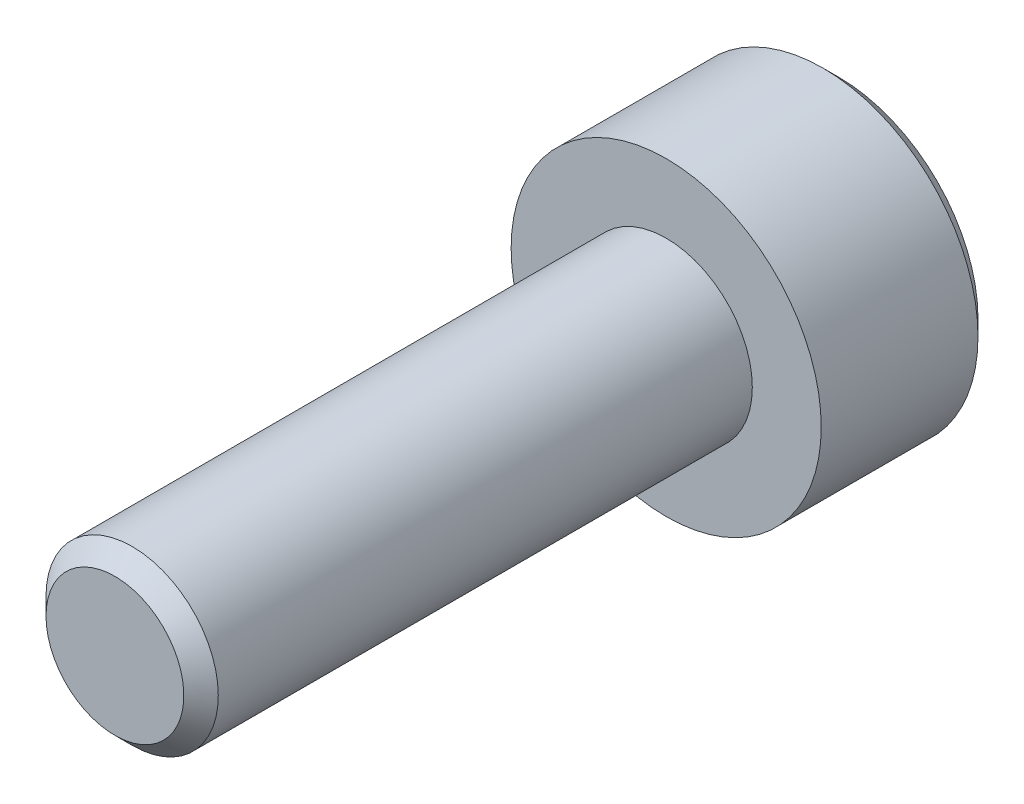
ISO-10303-21;
HEADER;
FILE_DESCRIPTION(('STEP AP214'),'2;1');
FILE_NAME('part.step','',(''),(''),'','','');
FILE_SCHEMA(('AUTOMOTIVE_DESIGN { 1 0 10303 214 1 1 1 1 }'));
ENDSEC;
DATA;
#1=APPLICATION_CONTEXT('core data for automotive mechanical design processes');
#2=APPLICATION_PROTOCOL_DEFINITION('international standard','automotive_design',2000,#1);
#3=PRODUCT_CONTEXT('',#1,'mechanical');
#4=PRODUCT('Part','Part','',(#3));
#5=PRODUCT_RELATED_PRODUCT_CATEGORY('part','',(#4));
#6=PRODUCT_DEFINITION_FORMATION('','',#4);
#7=PRODUCT_DEFINITION_CONTEXT('part definition',#1,'design');
#8=PRODUCT_DEFINITION('design','',#6,#7);
#9=PRODUCT_DEFINITION_SHAPE('','',#8);
#10=(LENGTH_UNIT() NAMED_UNIT(*) SI_UNIT(.MILLI.,.METRE.));
#11=(NAMED_UNIT(*) PLANE_ANGLE_UNIT() SI_UNIT($,.RADIAN.));
#12=(NAMED_UNIT(*) SI_UNIT($,.STERADIAN.) SOLID_ANGLE_UNIT());
#13=UNCERTAINTY_MEASURE_WITH_UNIT(LENGTH_MEASURE(1.E-05),#10,'distance_accuracy_value','');
#14=(GEOMETRIC_REPRESENTATION_CONTEXT(3) GLOBAL_UNCERTAINTY_ASSIGNED_CONTEXT((#13)) GLOBAL_UNIT_ASSIGNED_CONTEXT((#10,
#11,#12)) REPRESENTATION_CONTEXT('',''));
#15=CARTESIAN_POINT('',(0.,0.,0.));
#16=DIRECTION('',(0.,0.,1.));
#17=DIRECTION('',(1.,0.,0.));
#18=AXIS2_PLACEMENT_3D('',#15,#16,#17);
#19=CARTESIAN_POINT('',(0.,0.,-1.5));
#20=DIRECTION('',(0.,0.,1.));
#21=DIRECTION('',(1.,0.,0.));
#22=AXIS2_PLACEMENT_3D('',#19,#20,#21);
#23=PLANE('',#22);
#24=DIRECTION('',(-0.866025403784439,-0.5,0.));
#25=VECTOR('',#24,1.);
#26=CARTESIAN_POINT('',(-1.,0.577350269189626,-1.5));
#27=LINE('',#26,#25);
#28=CARTESIAN_POINT('',(-1.,0.577350269189626,-1.5));
#29=VERTEX_POINT('',#28);
#30=CARTESIAN_POINT('',(0.,1.15470053837925,-1.5));
#31=VERTEX_POINT('',#30);
#32=EDGE_CURVE('E125',#29,#31,#27,.F.);
#33=ORIENTED_EDGE('',*,*,#32,.T.);
#34=DIRECTION('',(-0.866025403784439,0.5,0.));
#35=VECTOR('',#34,1.);
#36=CARTESIAN_POINT('',(0.,1.15470053837925,-1.5));
#37=LINE('',#36,#35);
#38=CARTESIAN_POINT('',(1.,0.577350269189626,-1.5));
#39=VERTEX_POINT('',#38);
#40=EDGE_CURVE('E74',#31,#39,#37,.F.);
#41=ORIENTED_EDGE('',*,*,#40,.T.);
#42=DIRECTION('',(0.,1.,0.));
#43=VECTOR('',#42,1.);
#44=CARTESIAN_POINT('',(1.,0.577350269189626,-1.5));
#45=LINE('',#44,#43);
#46=CARTESIAN_POINT('',(1.,-0.577350269189626,-1.5));
#47=VERTEX_POINT('',#46);
#48=EDGE_CURVE('E71',#39,#47,#45,.F.);
#49=ORIENTED_EDGE('',*,*,#48,.T.);
#50=DIRECTION('',(0.866025403784439,0.499999999999999,0.));
#51=VECTOR('',#50,1.);
#52=CARTESIAN_POINT('',(1.,-0.577350269189626,-1.5));
#53=LINE('',#52,#51);
#54=CARTESIAN_POINT('',(0.,-1.15470053837925,-1.5));
#55=VERTEX_POINT('',#54);
#56=EDGE_CURVE('E68',#47,#55,#53,.F.);
#57=ORIENTED_EDGE('',*,*,#56,.T.);
#58=DIRECTION('',(0.866025403784438,-0.5,0.));
#59=VECTOR('',#58,1.);
#60=CARTESIAN_POINT('',(0.,-1.15470053837925,-1.5));
#61=LINE('',#60,#59);
#62=CARTESIAN_POINT('',(-1.,-0.577350269189625,-1.5));
#63=VERTEX_POINT('',#62);
#64=EDGE_CURVE('E91',#55,#63,#61,.F.);
#65=ORIENTED_EDGE('',*,*,#64,.T.);
#66=DIRECTION('',(0.,1.,0.));
#67=VECTOR('',#66,1.);
#68=CARTESIAN_POINT('',(-1.,-0.577350269189625,-1.5));
#69=LINE('',#68,#67);
#70=EDGE_CURVE('E130',#63,#29,#69,.T.);
#71=ORIENTED_EDGE('',*,*,#70,.T.);
#72=EDGE_LOOP('',(#33,#41,#49,#57,#65,#71));
#73=FACE_BOUND('',#72,.T.);
#74=ADVANCED_FACE('F17',(#73),#23,.F.);
#75=CARTESIAN_POINT('',(1.,0.577350269189626,-2.5));
#76=DIRECTION('',(1.,0.,0.));
#77=DIRECTION('',(0.,0.,-1.));
#78=AXIS2_PLACEMENT_3D('',#75,#76,#77);
#79=PLANE('',#78);
#80=ORIENTED_EDGE('',*,*,#48,.F.);
#81=DIRECTION('',(0.,0.,1.));
#82=VECTOR('',#81,1.);
#83=CARTESIAN_POINT('',(1.,0.577350269189625,-2.5));
#84=LINE('',#83,#82);
#85=CARTESIAN_POINT('',(1.,0.577350269189626,-2.5));
#86=VERTEX_POINT('',#85);
#87=EDGE_CURVE('E120',#39,#86,#84,.F.);
#88=ORIENTED_EDGE('',*,*,#87,.T.);
#89=DIRECTION('',(0.,1.,0.));
#90=VECTOR('',#89,1.);
#91=CARTESIAN_POINT('',(1.,0.,-2.5));
#92=LINE('',#91,#90);
#93=CARTESIAN_POINT('',(1.,-0.577350269189626,-2.5));
#94=VERTEX_POINT('',#93);
#95=EDGE_CURVE('E82',#86,#94,#92,.F.);
#96=ORIENTED_EDGE('',*,*,#95,.T.);
#97=DIRECTION('',(0.,0.,1.));
#98=VECTOR('',#97,1.);
#99=CARTESIAN_POINT('',(1.,-0.577350269189626,-2.5));
#100=LINE('',#99,#98);
#101=EDGE_CURVE('E77',#94,#47,#100,.T.);
#102=ORIENTED_EDGE('',*,*,#101,.T.);
#103=EDGE_LOOP('',(#80,#88,#96,#102));
#104=FACE_BOUND('',#103,.T.);
#105=ADVANCED_FACE('F80',(#104),#79,.F.);
#106=CARTESIAN_POINT('',(1.,-0.577350269189626,-2.5));
#107=DIRECTION('',(0.499999999999999,-0.866025403784439,0.));
#108=DIRECTION('',(0.866025403784439,0.499999999999999,0.));
#109=AXIS2_PLACEMENT_3D('',#106,#107,#108);
#110=PLANE('',#109);
#111=ORIENTED_EDGE('',*,*,#56,.F.);
#112=ORIENTED_EDGE('',*,*,#101,.F.);
#113=DIRECTION('',(-0.866025403784439,-0.499999999999999,0.));
#114=VECTOR('',#113,1.);
#115=CARTESIAN_POINT('',(1.,-0.577350269189626,-2.5));
#116=LINE('',#115,#114);
#117=CARTESIAN_POINT('',(0.,-1.15470053837925,-2.5));
#118=VERTEX_POINT('',#117);
#119=EDGE_CURVE('E117',#94,#118,#116,.T.);
#120=ORIENTED_EDGE('',*,*,#119,.T.);
#121=DIRECTION('',(0.,0.,1.));
#122=VECTOR('',#121,1.);
#123=CARTESIAN_POINT('',(0.,-1.15470053837925,-2.5));
#124=LINE('',#123,#122);
#125=EDGE_CURVE('E88',#118,#55,#124,.T.);
#126=ORIENTED_EDGE('',*,*,#125,.T.);
#127=EDGE_LOOP('',(#111,#112,#120,#126));
#128=FACE_BOUND('',#127,.T.);
#129=ADVANCED_FACE('F86',(#128),#110,.F.);
#130=CARTESIAN_POINT('',(0.,-1.15470053837925,-2.5));
#131=DIRECTION('',(-0.5,-0.866025403784438,0.));
#132=DIRECTION('',(0.866025403784438,-0.5,0.));
#133=AXIS2_PLACEMENT_3D('',#130,#131,#132);
#134=PLANE('',#133);
#135=ORIENTED_EDGE('',*,*,#64,.F.);
#136=ORIENTED_EDGE('',*,*,#125,.F.);
#137=DIRECTION('',(-0.866025403784439,0.5,0.));
#138=VECTOR('',#137,1.);
#139=CARTESIAN_POINT('',(0.,-1.15470053837925,-2.5));
#140=LINE('',#139,#138);
#141=CARTESIAN_POINT('',(-1.,-0.577350269189625,-2.5));
#142=VERTEX_POINT('',#141);
#143=EDGE_CURVE('E115',#118,#142,#140,.T.);
#144=ORIENTED_EDGE('',*,*,#143,.T.);
#145=DIRECTION('',(0.,0.,1.));
#146=VECTOR('',#145,1.);
#147=CARTESIAN_POINT('',(-1.,-0.577350269189625,-2.5));
#148=LINE('',#147,#146);
#149=EDGE_CURVE('E132',#142,#63,#148,.T.);
#150=ORIENTED_EDGE('',*,*,#149,.T.);
#151=EDGE_LOOP('',(#135,#136,#144,#150));
#152=FACE_BOUND('',#151,.T.);
#153=ADVANCED_FACE('F137',(#152),#134,.F.);
#154=CARTESIAN_POINT('',(-1.,-0.577350269189625,-2.5));
#155=DIRECTION('',(-1.,0.,0.));
#156=DIRECTION('',(0.,0.,1.));
#157=AXIS2_PLACEMENT_3D('',#154,#155,#156);
#158=PLANE('',#157);
#159=ORIENTED_EDGE('',*,*,#70,.F.);
#160=ORIENTED_EDGE('',*,*,#149,.F.);
#161=DIRECTION('',(0.,1.,0.));
#162=VECTOR('',#161,1.);
#163=CARTESIAN_POINT('',(-1.,0.,-2.5));
#164=LINE('',#163,#162);
#165=CARTESIAN_POINT('',(-1.,0.577350269189626,-2.5));
#166=VERTEX_POINT('',#165);
#167=EDGE_CURVE('E113',#142,#166,#164,.T.);
#168=ORIENTED_EDGE('',*,*,#167,.T.);
#169=DIRECTION('',(0.,0.,1.));
#170=VECTOR('',#169,1.);
#171=CARTESIAN_POINT('',(-1.,0.577350269189626,-2.5));
#172=LINE('',#171,#170);
#173=EDGE_CURVE('E127',#166,#29,#172,.T.);
#174=ORIENTED_EDGE('',*,*,#173,.T.);
#175=EDGE_LOOP('',(#159,#160,#168,#174));
#176=FACE_BOUND('',#175,.T.);
#177=ADVANCED_FACE('F141',(#176),#158,.F.);
#178=CARTESIAN_POINT('',(-1.,0.577350269189626,-2.5));
#179=DIRECTION('',(-0.5,0.866025403784439,0.));
#180=DIRECTION('',(-0.866025403784439,-0.5,0.));
#181=AXIS2_PLACEMENT_3D('',#178,#179,#180);
#182=PLANE('',#181);
#183=ORIENTED_EDGE('',*,*,#32,.F.);
#184=ORIENTED_EDGE('',*,*,#173,.F.);
#185=DIRECTION('',(0.866025403784439,0.499999999999999,0.));
#186=VECTOR('',#185,1.);
#187=CARTESIAN_POINT('',(-1.,0.577350269189626,-2.5));
#188=LINE('',#187,#186);
#189=CARTESIAN_POINT('',(0.,1.15470053837925,-2.5));
#190=VERTEX_POINT('',#189);
#191=EDGE_CURVE('E35',#166,#190,#188,.T.);
#192=ORIENTED_EDGE('',*,*,#191,.T.);
#193=DIRECTION('',(0.,0.,1.));
#194=VECTOR('',#193,1.);
#195=CARTESIAN_POINT('',(0.,1.15470053837925,-2.5));
#196=LINE('',#195,#194);
#197=EDGE_CURVE('E123',#190,#31,#196,.T.);
#198=ORIENTED_EDGE('',*,*,#197,.T.);
#199=EDGE_LOOP('',(#183,#184,#192,#198));
#200=FACE_BOUND('',#199,.T.);
#201=ADVANCED_FACE('F143',(#200),#182,.F.);
#202=CARTESIAN_POINT('',(0.,1.15470053837925,-2.5));
#203=DIRECTION('',(0.5,0.866025403784439,0.));
#204=DIRECTION('',(-0.866025403784439,0.5,0.));
#205=AXIS2_PLACEMENT_3D('',#202,#203,#204);
#206=PLANE('',#205);
#207=ORIENTED_EDGE('',*,*,#40,.F.);
#208=ORIENTED_EDGE('',*,*,#197,.F.);
#209=DIRECTION('',(0.866025403784439,-0.499999999999999,0.));
#210=VECTOR('',#209,1.);
#211=CARTESIAN_POINT('',(0.,1.15470053837925,-2.5));
#212=LINE('',#211,#210);
#213=EDGE_CURVE('E107',#190,#86,#212,.T.);
#214=ORIENTED_EDGE('',*,*,#213,.T.);
#215=ORIENTED_EDGE('',*,*,#87,.F.);
#216=EDGE_LOOP('',(#207,#208,#214,#215));
#217=FACE_BOUND('',#216,.T.);
#218=ADVANCED_FACE('F146',(#217),#206,.F.);
#219=CARTESIAN_POINT('',(0.,0.,-2.5));
#220=DIRECTION('',(0.,0.,1.));
#221=DIRECTION('',(1.,0.,0.));
#222=AXIS2_PLACEMENT_3D('',#219,#220,#221);
#223=PLANE('',#222);
#224=ORIENTED_EDGE('',*,*,#191,.F.);
#225=ORIENTED_EDGE('',*,*,#167,.F.);
#226=ORIENTED_EDGE('',*,*,#143,.F.);
#227=ORIENTED_EDGE('',*,*,#119,.F.);
#228=ORIENTED_EDGE('',*,*,#95,.F.);
#229=ORIENTED_EDGE('',*,*,#213,.F.);
#230=EDGE_LOOP('',(#224,#225,#226,#227,#228,#229));
#231=FACE_BOUND('',#230,.T.);
#232=CARTESIAN_POINT('',(0.,0.,-2.49999999999773));
#233=DIRECTION('',(0.,0.,1.));
#234=DIRECTION('',(1.,0.,0.));
#235=AXIS2_PLACEMENT_3D('',#232,#233,#234);
#236=CIRCLE('',#235,2.02499999994643);
#237=CARTESIAN_POINT('',(2.02499999994643,0.,-2.49999999999773));
#238=VERTEX_POINT('',#237);
#239=EDGE_CURVE('E20',#238,#238,#236,.T.);
#240=ORIENTED_EDGE('',*,*,#239,.F.);
#241=EDGE_LOOP('',(#240));
#242=FACE_BOUND('',#241,.T.);
#243=ADVANCED_FACE('F148',(#231,#242),#223,.F.);
#244=CARTESIAN_POINT('',(0.,0.,-2.27499999988368));
#245=DIRECTION('',(0.,0.,1.));
#246=DIRECTION('',(1.,0.,0.));
#247=AXIS2_PLACEMENT_3D('',#244,#245,#246);
#248=CONICAL_SURFACE('',#247,2.25000000006048,0.785398163397448);
#249=ORIENTED_EDGE('',*,*,#239,.T.);
#250=EDGE_LOOP('',(#249));
#251=FACE_BOUND('',#250,.T.);
#252=CARTESIAN_POINT('',(0.,0.,-2.275));
#253=DIRECTION('',(0.,0.,1.));
#254=DIRECTION('',(1.,0.,0.));
#255=AXIS2_PLACEMENT_3D('',#252,#253,#254);
#256=CIRCLE('',#255,2.25);
#257=CARTESIAN_POINT('',(2.25,0.,-2.275));
#258=VERTEX_POINT('',#257);
#259=EDGE_CURVE('E99',#258,#258,#256,.T.);
#260=ORIENTED_EDGE('',*,*,#259,.F.);
#261=EDGE_LOOP('',(#260));
#262=FACE_BOUND('',#261,.T.);
#263=ADVANCED_FACE('F151',(#251,#262),#248,.T.);
#264=CARTESIAN_POINT('',(0.,0.,8.));
#265=DIRECTION('',(0.,0.,1.));
#266=DIRECTION('',(1.,0.,0.));
#267=AXIS2_PLACEMENT_3D('',#264,#265,#266);
#268=PLANE('',#267);
#269=CARTESIAN_POINT('',(0.,0.,7.99999999998136));
#270=DIRECTION('',(0.,0.,-1.));
#271=DIRECTION('',(-1.,0.,0.));
#272=AXIS2_PLACEMENT_3D('',#269,#270,#271);
#273=CIRCLE('',#272,0.999999999976353);
#274=CARTESIAN_POINT('',(-0.999999999976353,0.,7.99999999998136));
#275=VERTEX_POINT('',#274);
#276=EDGE_CURVE('E97',#275,#275,#273,.T.);
#277=ORIENTED_EDGE('',*,*,#276,.F.);
#278=EDGE_LOOP('',(#277));
#279=FACE_BOUND('',#278,.T.);
#280=ADVANCED_FACE('F157',(#279),#268,.T.);
#281=CARTESIAN_POINT('',(0.,0.,-2.5));
#282=DIRECTION('',(0.,0.,1.));
#283=DIRECTION('',(1.,0.,0.));
#284=AXIS2_PLACEMENT_3D('',#281,#282,#283);
#285=CYLINDRICAL_SURFACE('',#284,2.25);
#286=ORIENTED_EDGE('',*,*,#259,.T.);
#287=EDGE_LOOP('',(#286));
#288=FACE_BOUND('',#287,.T.);
#289=CARTESIAN_POINT('',(0.,0.,0.));
#290=DIRECTION('',(0.,0.,1.));
#291=DIRECTION('',(1.,0.,0.));
#292=AXIS2_PLACEMENT_3D('',#289,#290,#291);
#293=CIRCLE('',#292,2.25);
#294=CARTESIAN_POINT('',(2.25,0.,0.));
#295=VERTEX_POINT('',#294);
#296=EDGE_CURVE('E95',#295,#295,#293,.T.);
#297=ORIENTED_EDGE('',*,*,#296,.F.);
#298=EDGE_LOOP('',(#297));
#299=FACE_BOUND('',#298,.T.);
#300=ADVANCED_FACE('F163',(#288,#299),#285,.T.);
#301=CARTESIAN_POINT('',(0.,0.,7.74999999998727));
#302=DIRECTION('',(0.,0.,-1.));
#303=DIRECTION('',(-1.,0.,0.));
#304=AXIS2_PLACEMENT_3D('',#301,#302,#303);
#305=CONICAL_SURFACE('',#304,1.24999999997044,0.785398163397448);
#306=CARTESIAN_POINT('',(0.,0.,7.75));
#307=DIRECTION('',(0.,0.,1.));
#308=DIRECTION('',(1.,0.,0.));
#309=AXIS2_PLACEMENT_3D('',#306,#307,#308);
#310=CIRCLE('',#309,1.25);
#311=CARTESIAN_POINT('',(1.25,0.,7.75));
#312=VERTEX_POINT('',#311);
#313=EDGE_CURVE('E26',#312,#312,#310,.F.);
#314=ORIENTED_EDGE('',*,*,#313,.F.);
#315=EDGE_LOOP('',(#314));
#316=FACE_BOUND('',#315,.T.);
#317=ORIENTED_EDGE('',*,*,#276,.T.);
#318=EDGE_LOOP('',(#317));
#319=FACE_BOUND('',#318,.T.);
#320=ADVANCED_FACE('F174',(#316,#319),#305,.T.);
#321=CARTESIAN_POINT('',(0.,0.,0.));
#322=DIRECTION('',(0.,0.,1.));
#323=DIRECTION('',(1.,0.,0.));
#324=AXIS2_PLACEMENT_3D('',#321,#322,#323);
#325=PLANE('',#324);
#326=CARTESIAN_POINT('',(0.,0.,0.));
#327=DIRECTION('',(0.,0.,1.));
#328=DIRECTION('',(1.,0.,0.));
#329=AXIS2_PLACEMENT_3D('',#326,#327,#328);
#330=CIRCLE('',#329,1.25);
#331=CARTESIAN_POINT('',(1.25,0.,0.));
#332=VERTEX_POINT('',#331);
#333=EDGE_CURVE('E11',#332,#332,#330,.T.);
#334=ORIENTED_EDGE('',*,*,#333,.F.);
#335=EDGE_LOOP('',(#334));
#336=FACE_BOUND('',#335,.T.);
#337=ORIENTED_EDGE('',*,*,#296,.T.);
#338=EDGE_LOOP('',(#337));
#339=FACE_BOUND('',#338,.T.);
#340=ADVANCED_FACE('F168',(#336,#339),#325,.T.);
#341=CARTESIAN_POINT('',(0.,0.,0.));
#342=DIRECTION('',(0.,0.,1.));
#343=DIRECTION('',(1.,0.,0.));
#344=AXIS2_PLACEMENT_3D('',#341,#342,#343);
#345=CYLINDRICAL_SURFACE('',#344,1.25);
#346=ORIENTED_EDGE('',*,*,#333,.T.);
#347=EDGE_LOOP('',(#346));
#348=FACE_BOUND('',#347,.T.);
#349=ORIENTED_EDGE('',*,*,#313,.T.);
#350=EDGE_LOOP('',(#349));
#351=FACE_BOUND('',#350,.T.);
#352=ADVANCED_FACE('F166',(#348,#351),#345,.T.);
#353=CLOSED_SHELL('',(#74,#105,#129,#153,#177,#201,#218,#243,#263,#280,#300,#320,#340,#352));
#354=MANIFOLD_SOLID_BREP('B1',#353);
#355=ADVANCED_BREP_SHAPE_REPRESENTATION('',(#18,#354),#14);
#356=SHAPE_DEFINITION_REPRESENTATION(#9,#355);
ENDSEC;
END-ISO-10303-21;
